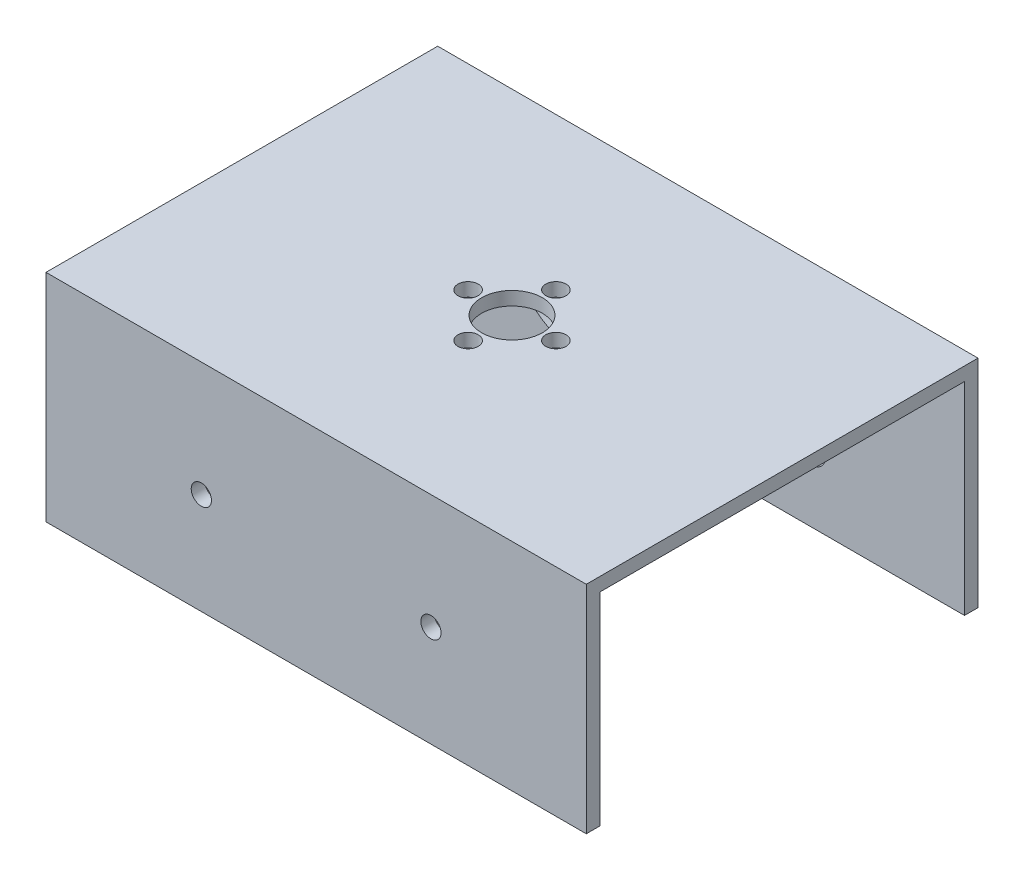
ISO-10303-21;
HEADER;
FILE_DESCRIPTION(('STEP AP214'),'2;1');
FILE_NAME('part.step','',(''),(''),'','','');
FILE_SCHEMA(('AUTOMOTIVE_DESIGN { 1 0 10303 214 1 1 1 1 }'));
ENDSEC;
DATA;
#1=APPLICATION_CONTEXT('core data for automotive mechanical design processes');
#2=APPLICATION_PROTOCOL_DEFINITION('international standard','automotive_design',2000,#1);
#3=PRODUCT_CONTEXT('',#1,'mechanical');
#4=PRODUCT('Part','Part','',(#3));
#5=PRODUCT_RELATED_PRODUCT_CATEGORY('part','',(#4));
#6=PRODUCT_DEFINITION_FORMATION('','',#4);
#7=PRODUCT_DEFINITION_CONTEXT('part definition',#1,'design');
#8=PRODUCT_DEFINITION('design','',#6,#7);
#9=PRODUCT_DEFINITION_SHAPE('','',#8);
#10=(LENGTH_UNIT() NAMED_UNIT(*) SI_UNIT(.MILLI.,.METRE.));
#11=(NAMED_UNIT(*) PLANE_ANGLE_UNIT() SI_UNIT($,.RADIAN.));
#12=(NAMED_UNIT(*) SI_UNIT($,.STERADIAN.) SOLID_ANGLE_UNIT());
#13=UNCERTAINTY_MEASURE_WITH_UNIT(LENGTH_MEASURE(1.E-05),#10,'distance_accuracy_value','');
#14=(GEOMETRIC_REPRESENTATION_CONTEXT(3) GLOBAL_UNCERTAINTY_ASSIGNED_CONTEXT((#13)) GLOBAL_UNIT_ASSIGNED_CONTEXT((#10,
#11,#12)) REPRESENTATION_CONTEXT('',''));
#15=CARTESIAN_POINT('',(0.,0.,0.));
#16=DIRECTION('',(0.,0.,1.));
#17=DIRECTION('',(1.,0.,0.));
#18=AXIS2_PLACEMENT_3D('',#15,#16,#17);
#19=CARTESIAN_POINT('',(0.,15.,0.));
#20=DIRECTION('',(0.,-1.,0.));
#21=DIRECTION('',(0.,0.,-1.));
#22=AXIS2_PLACEMENT_3D('',#19,#20,#21);
#23=PLANE('',#22);
#24=CARTESIAN_POINT('',(-6.49999999999999,15.,-27.));
#25=DIRECTION('',(0.,-1.,0.));
#26=DIRECTION('',(0.,0.,-1.));
#27=AXIS2_PLACEMENT_3D('',#24,#25,#26);
#28=CIRCLE('',#27,1.5);
#29=CARTESIAN_POINT('',(-6.49999999999999,15.,-28.5));
#30=VERTEX_POINT('',#29);
#31=EDGE_CURVE('E193',#30,#30,#28,.F.);
#32=ORIENTED_EDGE('',*,*,#31,.T.);
#33=EDGE_LOOP('',(#32));
#34=FACE_BOUND('',#33,.T.);
#35=CARTESIAN_POINT('',(6.5,15.,-27.));
#36=DIRECTION('',(0.,-1.,0.));
#37=DIRECTION('',(0.,0.,-1.));
#38=AXIS2_PLACEMENT_3D('',#35,#36,#37);
#39=CIRCLE('',#38,1.5);
#40=CARTESIAN_POINT('',(6.5,15.,-28.5));
#41=VERTEX_POINT('',#40);
#42=EDGE_CURVE('E199',#41,#41,#39,.F.);
#43=ORIENTED_EDGE('',*,*,#42,.T.);
#44=EDGE_LOOP('',(#43));
#45=FACE_BOUND('',#44,.T.);
#46=CARTESIAN_POINT('',(0.,15.,-33.5));
#47=DIRECTION('',(0.,-1.,0.));
#48=DIRECTION('',(0.,0.,-1.));
#49=AXIS2_PLACEMENT_3D('',#46,#47,#48);
#50=CIRCLE('',#49,1.5);
#51=CARTESIAN_POINT('',(0.,15.,-35.));
#52=VERTEX_POINT('',#51);
#53=EDGE_CURVE('E200',#52,#52,#50,.F.);
#54=ORIENTED_EDGE('',*,*,#53,.T.);
#55=EDGE_LOOP('',(#54));
#56=FACE_BOUND('',#55,.T.);
#57=CARTESIAN_POINT('',(0.,15.,-20.5));
#58=DIRECTION('',(0.,-1.,0.));
#59=DIRECTION('',(0.,0.,-1.));
#60=AXIS2_PLACEMENT_3D('',#57,#58,#59);
#61=CIRCLE('',#60,1.5);
#62=CARTESIAN_POINT('',(0.,15.,-22.));
#63=VERTEX_POINT('',#62);
#64=EDGE_CURVE('E211',#63,#63,#61,.F.);
#65=ORIENTED_EDGE('',*,*,#64,.T.);
#66=EDGE_LOOP('',(#65));
#67=FACE_BOUND('',#66,.T.);
#68=CARTESIAN_POINT('',(0.,15.,-27.));
#69=DIRECTION('',(0.,-1.,0.));
#70=DIRECTION('',(0.,0.,-1.));
#71=AXIS2_PLACEMENT_3D('',#68,#69,#70);
#72=CIRCLE('',#71,4.5);
#73=CARTESIAN_POINT('',(0.,15.,-31.5));
#74=VERTEX_POINT('',#73);
#75=EDGE_CURVE('E190',#74,#74,#72,.F.);
#76=ORIENTED_EDGE('',*,*,#75,.T.);
#77=EDGE_LOOP('',(#76));
#78=FACE_BOUND('',#77,.T.);
#79=DIRECTION('',(0.,0.,1.));
#80=VECTOR('',#79,1.);
#81=CARTESIAN_POINT('',(-40.,15.,2.));
#82=LINE('',#81,#80);
#83=CARTESIAN_POINT('',(-40.,15.,-54.));
#84=VERTEX_POINT('',#83);
#85=CARTESIAN_POINT('',(-40.,15.,0.));
#86=VERTEX_POINT('',#85);
#87=EDGE_CURVE('E115',#84,#86,#82,.T.);
#88=ORIENTED_EDGE('',*,*,#87,.F.);
#89=DIRECTION('',(-1.,0.,0.));
#90=VECTOR('',#89,1.);
#91=CARTESIAN_POINT('',(40.,15.,-54.));
#92=LINE('',#91,#90);
#93=CARTESIAN_POINT('',(40.,15.,-54.));
#94=VERTEX_POINT('',#93);
#95=EDGE_CURVE('E120',#94,#84,#92,.T.);
#96=ORIENTED_EDGE('',*,*,#95,.F.);
#97=DIRECTION('',(0.,0.,-1.));
#98=VECTOR('',#97,1.);
#99=CARTESIAN_POINT('',(40.,15.,-56.));
#100=LINE('',#99,#98);
#101=CARTESIAN_POINT('',(40.,15.,0.));
#102=VERTEX_POINT('',#101);
#103=EDGE_CURVE('E119',#102,#94,#100,.T.);
#104=ORIENTED_EDGE('',*,*,#103,.F.);
#105=DIRECTION('',(-1.,0.,0.));
#106=VECTOR('',#105,1.);
#107=CARTESIAN_POINT('',(-40.,15.,0.));
#108=LINE('',#107,#106);
#109=EDGE_CURVE('E99',#102,#86,#108,.T.);
#110=ORIENTED_EDGE('',*,*,#109,.T.);
#111=EDGE_LOOP('',(#88,#96,#104,#110));
#112=FACE_BOUND('',#111,.T.);
#113=ADVANCED_FACE('F39',(#34,#45,#56,#67,#78,#112),#23,.T.);
#114=CARTESIAN_POINT('',(40.,-15.,2.));
#115=DIRECTION('',(-1.,0.,0.));
#116=DIRECTION('',(0.,0.,1.));
#117=AXIS2_PLACEMENT_3D('',#114,#115,#116);
#118=PLANE('',#117);
#119=DIRECTION('',(0.,1.,0.));
#120=VECTOR('',#119,1.);
#121=CARTESIAN_POINT('',(40.,-15.,0.));
#122=LINE('',#121,#120);
#123=CARTESIAN_POINT('',(40.,-15.,0.));
#124=VERTEX_POINT('',#123);
#125=EDGE_CURVE('E93',#124,#102,#122,.T.);
#126=ORIENTED_EDGE('',*,*,#125,.T.);
#127=ORIENTED_EDGE('',*,*,#103,.T.);
#128=DIRECTION('',(0.,1.,0.));
#129=VECTOR('',#128,1.);
#130=CARTESIAN_POINT('',(40.,-15.,-54.));
#131=LINE('',#130,#129);
#132=CARTESIAN_POINT('',(40.,-15.,-54.));
#133=VERTEX_POINT('',#132);
#134=EDGE_CURVE('E55',#133,#94,#131,.T.);
#135=ORIENTED_EDGE('',*,*,#134,.F.);
#136=DIRECTION('',(0.,0.,1.));
#137=VECTOR('',#136,1.);
#138=CARTESIAN_POINT('',(40.,-15.,-56.));
#139=LINE('',#138,#137);
#140=CARTESIAN_POINT('',(40.,-15.,-56.));
#141=VERTEX_POINT('',#140);
#142=EDGE_CURVE('E156',#141,#133,#139,.T.);
#143=ORIENTED_EDGE('',*,*,#142,.F.);
#144=DIRECTION('',(0.,-1.,0.));
#145=VECTOR('',#144,1.);
#146=CARTESIAN_POINT('',(40.,17.,-56.));
#147=LINE('',#146,#145);
#148=CARTESIAN_POINT('',(40.,17.,-56.));
#149=VERTEX_POINT('',#148);
#150=EDGE_CURVE('E104',#149,#141,#147,.T.);
#151=ORIENTED_EDGE('',*,*,#150,.F.);
#152=DIRECTION('',(0.,0.,-1.));
#153=VECTOR('',#152,1.);
#154=CARTESIAN_POINT('',(40.,17.,-56.));
#155=LINE('',#154,#153);
#156=CARTESIAN_POINT('',(40.,17.,2.));
#157=VERTEX_POINT('',#156);
#158=EDGE_CURVE('E130',#157,#149,#155,.T.);
#159=ORIENTED_EDGE('',*,*,#158,.F.);
#160=DIRECTION('',(0.,1.,0.));
#161=VECTOR('',#160,1.);
#162=CARTESIAN_POINT('',(40.,-15.,2.));
#163=LINE('',#162,#161);
#164=CARTESIAN_POINT('',(40.,-15.,2.));
#165=VERTEX_POINT('',#164);
#166=EDGE_CURVE('E87',#165,#157,#163,.T.);
#167=ORIENTED_EDGE('',*,*,#166,.F.);
#168=DIRECTION('',(0.,0.,-1.));
#169=VECTOR('',#168,1.);
#170=CARTESIAN_POINT('',(40.,-15.,2.));
#171=LINE('',#170,#169);
#172=EDGE_CURVE('E48',#165,#124,#171,.T.);
#173=ORIENTED_EDGE('',*,*,#172,.T.);
#174=EDGE_LOOP('',(#126,#127,#135,#143,#151,#159,#167,#173));
#175=FACE_BOUND('',#174,.T.);
#176=ADVANCED_FACE('F41',(#175),#118,.F.);
#177=CARTESIAN_POINT('',(-40.,-15.,2.));
#178=DIRECTION('',(1.,0.,0.));
#179=DIRECTION('',(0.,0.,-1.));
#180=AXIS2_PLACEMENT_3D('',#177,#178,#179);
#181=PLANE('',#180);
#182=DIRECTION('',(0.,-1.,0.));
#183=VECTOR('',#182,1.);
#184=CARTESIAN_POINT('',(-40.,-15.,0.));
#185=LINE('',#184,#183);
#186=CARTESIAN_POINT('',(-40.,-15.,0.));
#187=VERTEX_POINT('',#186);
#188=EDGE_CURVE('E88',#86,#187,#185,.T.);
#189=ORIENTED_EDGE('',*,*,#188,.T.);
#190=DIRECTION('',(0.,0.,-1.));
#191=VECTOR('',#190,1.);
#192=CARTESIAN_POINT('',(-40.,-15.,2.));
#193=LINE('',#192,#191);
#194=CARTESIAN_POINT('',(-40.,-15.,2.));
#195=VERTEX_POINT('',#194);
#196=EDGE_CURVE('E11',#195,#187,#193,.T.);
#197=ORIENTED_EDGE('',*,*,#196,.F.);
#198=DIRECTION('',(0.,-1.,0.));
#199=VECTOR('',#198,1.);
#200=CARTESIAN_POINT('',(-40.,-15.,2.));
#201=LINE('',#200,#199);
#202=CARTESIAN_POINT('',(-40.,17.,2.));
#203=VERTEX_POINT('',#202);
#204=EDGE_CURVE('E132',#203,#195,#201,.T.);
#205=ORIENTED_EDGE('',*,*,#204,.F.);
#206=DIRECTION('',(0.,0.,1.));
#207=VECTOR('',#206,1.);
#208=CARTESIAN_POINT('',(-40.,17.,2.));
#209=LINE('',#208,#207);
#210=CARTESIAN_POINT('',(-40.,17.,-56.));
#211=VERTEX_POINT('',#210);
#212=EDGE_CURVE('E124',#211,#203,#209,.T.);
#213=ORIENTED_EDGE('',*,*,#212,.F.);
#214=DIRECTION('',(0.,-1.,0.));
#215=VECTOR('',#214,1.);
#216=CARTESIAN_POINT('',(-40.,17.,-56.));
#217=LINE('',#216,#215);
#218=CARTESIAN_POINT('',(-40.,-15.,-56.));
#219=VERTEX_POINT('',#218);
#220=EDGE_CURVE('E100',#211,#219,#217,.T.);
#221=ORIENTED_EDGE('',*,*,#220,.T.);
#222=DIRECTION('',(0.,0.,-1.));
#223=VECTOR('',#222,1.);
#224=CARTESIAN_POINT('',(-40.,-15.,-54.));
#225=LINE('',#224,#223);
#226=CARTESIAN_POINT('',(-40.,-15.,-54.));
#227=VERTEX_POINT('',#226);
#228=EDGE_CURVE('E167',#227,#219,#225,.T.);
#229=ORIENTED_EDGE('',*,*,#228,.F.);
#230=DIRECTION('',(0.,1.,0.));
#231=VECTOR('',#230,1.);
#232=CARTESIAN_POINT('',(-40.,-15.,-54.));
#233=LINE('',#232,#231);
#234=EDGE_CURVE('E180',#227,#84,#233,.T.);
#235=ORIENTED_EDGE('',*,*,#234,.T.);
#236=ORIENTED_EDGE('',*,*,#87,.T.);
#237=EDGE_LOOP('',(#189,#197,#205,#213,#221,#229,#235,#236));
#238=FACE_BOUND('',#237,.T.);
#239=ADVANCED_FACE('F111',(#238),#181,.F.);
#240=CARTESIAN_POINT('',(-40.,-15.,2.));
#241=DIRECTION('',(0.,1.,0.));
#242=DIRECTION('',(0.,0.,1.));
#243=AXIS2_PLACEMENT_3D('',#240,#241,#242);
#244=PLANE('',#243);
#245=DIRECTION('',(1.,0.,0.));
#246=VECTOR('',#245,1.);
#247=CARTESIAN_POINT('',(-40.,-15.,0.));
#248=LINE('',#247,#246);
#249=EDGE_CURVE('E79',#187,#124,#248,.T.);
#250=ORIENTED_EDGE('',*,*,#249,.T.);
#251=ORIENTED_EDGE('',*,*,#172,.F.);
#252=DIRECTION('',(1.,0.,0.));
#253=VECTOR('',#252,1.);
#254=CARTESIAN_POINT('',(-40.,-15.,2.));
#255=LINE('',#254,#253);
#256=EDGE_CURVE('E64',#195,#165,#255,.T.);
#257=ORIENTED_EDGE('',*,*,#256,.F.);
#258=ORIENTED_EDGE('',*,*,#196,.T.);
#259=EDGE_LOOP('',(#250,#251,#257,#258));
#260=FACE_BOUND('',#259,.T.);
#261=ADVANCED_FACE('F81',(#260),#244,.F.);
#262=CARTESIAN_POINT('',(0.,0.,2.));
#263=DIRECTION('',(0.,0.,-1.));
#264=DIRECTION('',(-1.,0.,0.));
#265=AXIS2_PLACEMENT_3D('',#262,#263,#264);
#266=PLANE('',#265);
#267=CARTESIAN_POINT('',(17.,0.,2.));
#268=DIRECTION('',(0.,0.,-1.));
#269=DIRECTION('',(-1.,0.,0.));
#270=AXIS2_PLACEMENT_3D('',#267,#268,#269);
#271=CIRCLE('',#270,1.5);
#272=CARTESIAN_POINT('',(15.5,0.,2.));
#273=VERTEX_POINT('',#272);
#274=EDGE_CURVE('E225',#273,#273,#271,.F.);
#275=ORIENTED_EDGE('',*,*,#274,.F.);
#276=EDGE_LOOP('',(#275));
#277=FACE_BOUND('',#276,.T.);
#278=CARTESIAN_POINT('',(-17.,0.,2.));
#279=DIRECTION('',(0.,0.,-1.));
#280=DIRECTION('',(-1.,0.,0.));
#281=AXIS2_PLACEMENT_3D('',#278,#279,#280);
#282=CIRCLE('',#281,1.5);
#283=CARTESIAN_POINT('',(-18.5,0.,2.));
#284=VERTEX_POINT('',#283);
#285=EDGE_CURVE('E226',#284,#284,#282,.F.);
#286=ORIENTED_EDGE('',*,*,#285,.F.);
#287=EDGE_LOOP('',(#286));
#288=FACE_BOUND('',#287,.T.);
#289=ORIENTED_EDGE('',*,*,#166,.T.);
#290=DIRECTION('',(1.,0.,0.));
#291=VECTOR('',#290,1.);
#292=CARTESIAN_POINT('',(-40.,17.,2.));
#293=LINE('',#292,#291);
#294=EDGE_CURVE('E137',#203,#157,#293,.T.);
#295=ORIENTED_EDGE('',*,*,#294,.F.);
#296=ORIENTED_EDGE('',*,*,#204,.T.);
#297=ORIENTED_EDGE('',*,*,#256,.T.);
#298=EDGE_LOOP('',(#289,#295,#296,#297));
#299=FACE_BOUND('',#298,.T.);
#300=ADVANCED_FACE('F134',(#277,#288,#299),#266,.F.);
#301=CARTESIAN_POINT('',(0.,0.,0.));
#302=DIRECTION('',(0.,0.,-1.));
#303=DIRECTION('',(-1.,0.,0.));
#304=AXIS2_PLACEMENT_3D('',#301,#302,#303);
#305=PLANE('',#304);
#306=CARTESIAN_POINT('',(17.,0.,0.));
#307=DIRECTION('',(0.,0.,-1.));
#308=DIRECTION('',(-1.,0.,0.));
#309=AXIS2_PLACEMENT_3D('',#306,#307,#308);
#310=CIRCLE('',#309,1.5);
#311=CARTESIAN_POINT('',(15.5,0.,0.));
#312=VERTEX_POINT('',#311);
#313=EDGE_CURVE('E212',#312,#312,#310,.T.);
#314=ORIENTED_EDGE('',*,*,#313,.F.);
#315=EDGE_LOOP('',(#314));
#316=FACE_BOUND('',#315,.T.);
#317=CARTESIAN_POINT('',(-17.,0.,0.));
#318=DIRECTION('',(0.,0.,-1.));
#319=DIRECTION('',(-1.,0.,0.));
#320=AXIS2_PLACEMENT_3D('',#317,#318,#319);
#321=CIRCLE('',#320,1.5);
#322=CARTESIAN_POINT('',(-18.5,0.,0.));
#323=VERTEX_POINT('',#322);
#324=EDGE_CURVE('E222',#323,#323,#321,.T.);
#325=ORIENTED_EDGE('',*,*,#324,.F.);
#326=EDGE_LOOP('',(#325));
#327=FACE_BOUND('',#326,.T.);
#328=ORIENTED_EDGE('',*,*,#125,.F.);
#329=ORIENTED_EDGE('',*,*,#249,.F.);
#330=ORIENTED_EDGE('',*,*,#188,.F.);
#331=ORIENTED_EDGE('',*,*,#109,.F.);
#332=EDGE_LOOP('',(#328,#329,#330,#331));
#333=FACE_BOUND('',#332,.T.);
#334=ADVANCED_FACE('F97',(#316,#327,#333),#305,.T.);
#335=CARTESIAN_POINT('',(-40.,17.,-56.));
#336=DIRECTION('',(0.,0.,1.));
#337=DIRECTION('',(1.,0.,0.));
#338=AXIS2_PLACEMENT_3D('',#335,#336,#337);
#339=PLANE('',#338);
#340=CARTESIAN_POINT('',(-32.07,5.,-56.));
#341=DIRECTION('',(0.,0.,1.));
#342=DIRECTION('',(1.,0.,0.));
#343=AXIS2_PLACEMENT_3D('',#340,#341,#342);
#344=CIRCLE('',#343,2.);
#345=CARTESIAN_POINT('',(-30.07,5.,-56.));
#346=VERTEX_POINT('',#345);
#347=EDGE_CURVE('E248',#346,#346,#344,.F.);
#348=ORIENTED_EDGE('',*,*,#347,.F.);
#349=EDGE_LOOP('',(#348));
#350=FACE_BOUND('',#349,.T.);
#351=CARTESIAN_POINT('',(-32.07,-5.,-56.));
#352=DIRECTION('',(0.,0.,1.));
#353=DIRECTION('',(1.,0.,0.));
#354=AXIS2_PLACEMENT_3D('',#351,#352,#353);
#355=CIRCLE('',#354,2.);
#356=CARTESIAN_POINT('',(-30.07,-5.,-56.));
#357=VERTEX_POINT('',#356);
#358=EDGE_CURVE('E257',#357,#357,#355,.F.);
#359=ORIENTED_EDGE('',*,*,#358,.F.);
#360=EDGE_LOOP('',(#359));
#361=FACE_BOUND('',#360,.T.);
#362=CARTESIAN_POINT('',(17.42,5.,-56.));
#363=DIRECTION('',(0.,0.,1.));
#364=DIRECTION('',(1.,0.,0.));
#365=AXIS2_PLACEMENT_3D('',#362,#363,#364);
#366=CIRCLE('',#365,2.);
#367=CARTESIAN_POINT('',(19.42,5.,-56.));
#368=VERTEX_POINT('',#367);
#369=EDGE_CURVE('E240',#368,#368,#366,.F.);
#370=ORIENTED_EDGE('',*,*,#369,.F.);
#371=EDGE_LOOP('',(#370));
#372=FACE_BOUND('',#371,.T.);
#373=CARTESIAN_POINT('',(17.42,-5.,-56.));
#374=DIRECTION('',(0.,0.,1.));
#375=DIRECTION('',(1.,0.,0.));
#376=AXIS2_PLACEMENT_3D('',#373,#374,#375);
#377=CIRCLE('',#376,2.);
#378=CARTESIAN_POINT('',(19.42,-5.,-56.));
#379=VERTEX_POINT('',#378);
#380=EDGE_CURVE('E245',#379,#379,#377,.F.);
#381=ORIENTED_EDGE('',*,*,#380,.F.);
#382=EDGE_LOOP('',(#381));
#383=FACE_BOUND('',#382,.T.);
#384=CARTESIAN_POINT('',(-17.,0.,-56.));
#385=DIRECTION('',(0.,0.,-1.));
#386=DIRECTION('',(-1.,0.,0.));
#387=AXIS2_PLACEMENT_3D('',#384,#385,#386);
#388=CIRCLE('',#387,10.);
#389=CARTESIAN_POINT('',(-27.,0.,-56.));
#390=VERTEX_POINT('',#389);
#391=EDGE_CURVE('E237',#390,#390,#388,.T.);
#392=ORIENTED_EDGE('',*,*,#391,.F.);
#393=EDGE_LOOP('',(#392));
#394=FACE_BOUND('',#393,.T.);
#395=CARTESIAN_POINT('',(17.,0.,-56.));
#396=DIRECTION('',(0.,0.,-1.));
#397=DIRECTION('',(-1.,0.,0.));
#398=AXIS2_PLACEMENT_3D('',#395,#396,#397);
#399=CIRCLE('',#398,1.5);
#400=CARTESIAN_POINT('',(15.5,0.,-56.));
#401=VERTEX_POINT('',#400);
#402=EDGE_CURVE('E229',#401,#401,#399,.T.);
#403=ORIENTED_EDGE('',*,*,#402,.F.);
#404=EDGE_LOOP('',(#403));
#405=FACE_BOUND('',#404,.T.);
#406=ORIENTED_EDGE('',*,*,#150,.T.);
#407=DIRECTION('',(1.,0.,0.));
#408=VECTOR('',#407,1.);
#409=CARTESIAN_POINT('',(-40.,-15.,-56.));
#410=LINE('',#409,#408);
#411=EDGE_CURVE('E162',#219,#141,#410,.T.);
#412=ORIENTED_EDGE('',*,*,#411,.F.);
#413=ORIENTED_EDGE('',*,*,#220,.F.);
#414=DIRECTION('',(-1.,0.,0.));
#415=VECTOR('',#414,1.);
#416=CARTESIAN_POINT('',(-40.,17.,-56.));
#417=LINE('',#416,#415);
#418=EDGE_CURVE('E121',#149,#211,#417,.T.);
#419=ORIENTED_EDGE('',*,*,#418,.F.);
#420=EDGE_LOOP('',(#406,#412,#413,#419));
#421=FACE_BOUND('',#420,.T.);
#422=ADVANCED_FACE('F160',(#350,#361,#372,#383,#394,#405,#421),#339,.F.);
#423=CARTESIAN_POINT('',(0.,17.,0.));
#424=DIRECTION('',(0.,-1.,0.));
#425=DIRECTION('',(0.,0.,-1.));
#426=AXIS2_PLACEMENT_3D('',#423,#424,#425);
#427=PLANE('',#426);
#428=CARTESIAN_POINT('',(-6.49999999999999,17.,-27.));
#429=DIRECTION('',(0.,1.,0.));
#430=DIRECTION('',(0.,0.,1.));
#431=AXIS2_PLACEMENT_3D('',#428,#429,#430);
#432=CIRCLE('',#431,1.5);
#433=CARTESIAN_POINT('',(-6.49999999999999,17.,-25.5));
#434=VERTEX_POINT('',#433);
#435=EDGE_CURVE('E203',#434,#434,#432,.T.);
#436=ORIENTED_EDGE('',*,*,#435,.F.);
#437=EDGE_LOOP('',(#436));
#438=FACE_BOUND('',#437,.T.);
#439=CARTESIAN_POINT('',(6.5,17.,-27.));
#440=DIRECTION('',(0.,1.,0.));
#441=DIRECTION('',(0.,0.,1.));
#442=AXIS2_PLACEMENT_3D('',#439,#440,#441);
#443=CIRCLE('',#442,1.5);
#444=CARTESIAN_POINT('',(6.5,17.,-25.5));
#445=VERTEX_POINT('',#444);
#446=EDGE_CURVE('E196',#445,#445,#443,.T.);
#447=ORIENTED_EDGE('',*,*,#446,.F.);
#448=EDGE_LOOP('',(#447));
#449=FACE_BOUND('',#448,.T.);
#450=CARTESIAN_POINT('',(0.,17.,-33.5));
#451=DIRECTION('',(0.,1.,0.));
#452=DIRECTION('',(0.,0.,1.));
#453=AXIS2_PLACEMENT_3D('',#450,#451,#452);
#454=CIRCLE('',#453,1.5);
#455=CARTESIAN_POINT('',(0.,17.,-32.));
#456=VERTEX_POINT('',#455);
#457=EDGE_CURVE('E215',#456,#456,#454,.T.);
#458=ORIENTED_EDGE('',*,*,#457,.F.);
#459=EDGE_LOOP('',(#458));
#460=FACE_BOUND('',#459,.T.);
#461=CARTESIAN_POINT('',(0.,17.,-20.5));
#462=DIRECTION('',(0.,1.,0.));
#463=DIRECTION('',(0.,0.,1.));
#464=AXIS2_PLACEMENT_3D('',#461,#462,#463);
#465=CIRCLE('',#464,1.5);
#466=CARTESIAN_POINT('',(0.,17.,-19.));
#467=VERTEX_POINT('',#466);
#468=EDGE_CURVE('E208',#467,#467,#465,.T.);
#469=ORIENTED_EDGE('',*,*,#468,.F.);
#470=EDGE_LOOP('',(#469));
#471=FACE_BOUND('',#470,.T.);
#472=CARTESIAN_POINT('',(0.,17.,-27.));
#473=DIRECTION('',(0.,1.,0.));
#474=DIRECTION('',(0.,0.,1.));
#475=AXIS2_PLACEMENT_3D('',#472,#473,#474);
#476=CIRCLE('',#475,4.5);
#477=CARTESIAN_POINT('',(0.,17.,-22.5));
#478=VERTEX_POINT('',#477);
#479=EDGE_CURVE('E185',#478,#478,#476,.T.);
#480=ORIENTED_EDGE('',*,*,#479,.F.);
#481=EDGE_LOOP('',(#480));
#482=FACE_BOUND('',#481,.T.);
#483=ORIENTED_EDGE('',*,*,#418,.T.);
#484=ORIENTED_EDGE('',*,*,#212,.T.);
#485=ORIENTED_EDGE('',*,*,#294,.T.);
#486=ORIENTED_EDGE('',*,*,#158,.T.);
#487=EDGE_LOOP('',(#483,#484,#485,#486));
#488=FACE_BOUND('',#487,.T.);
#489=ADVANCED_FACE('F144',(#438,#449,#460,#471,#482,#488),#427,.F.);
#490=CARTESIAN_POINT('',(40.,-15.,-54.));
#491=DIRECTION('',(0.,0.,-1.));
#492=DIRECTION('',(-1.,0.,0.));
#493=AXIS2_PLACEMENT_3D('',#490,#491,#492);
#494=PLANE('',#493);
#495=CARTESIAN_POINT('',(-32.07,5.,-54.));
#496=DIRECTION('',(0.,0.,1.));
#497=DIRECTION('',(1.,0.,0.));
#498=AXIS2_PLACEMENT_3D('',#495,#496,#497);
#499=CIRCLE('',#498,2.);
#500=CARTESIAN_POINT('',(-30.07,5.,-54.));
#501=VERTEX_POINT('',#500);
#502=EDGE_CURVE('E256',#501,#501,#499,.T.);
#503=ORIENTED_EDGE('',*,*,#502,.F.);
#504=EDGE_LOOP('',(#503));
#505=FACE_BOUND('',#504,.T.);
#506=CARTESIAN_POINT('',(-32.07,-5.,-54.));
#507=DIRECTION('',(0.,0.,1.));
#508=DIRECTION('',(1.,0.,0.));
#509=AXIS2_PLACEMENT_3D('',#506,#507,#508);
#510=CIRCLE('',#509,2.);
#511=CARTESIAN_POINT('',(-30.07,-5.,-54.));
#512=VERTEX_POINT('',#511);
#513=EDGE_CURVE('E253',#512,#512,#510,.T.);
#514=ORIENTED_EDGE('',*,*,#513,.F.);
#515=EDGE_LOOP('',(#514));
#516=FACE_BOUND('',#515,.T.);
#517=CARTESIAN_POINT('',(17.42,5.,-54.));
#518=DIRECTION('',(0.,0.,1.));
#519=DIRECTION('',(1.,0.,0.));
#520=AXIS2_PLACEMENT_3D('',#517,#518,#519);
#521=CIRCLE('',#520,2.);
#522=CARTESIAN_POINT('',(19.42,5.,-54.));
#523=VERTEX_POINT('',#522);
#524=EDGE_CURVE('E244',#523,#523,#521,.T.);
#525=ORIENTED_EDGE('',*,*,#524,.F.);
#526=EDGE_LOOP('',(#525));
#527=FACE_BOUND('',#526,.T.);
#528=CARTESIAN_POINT('',(17.42,-5.,-54.));
#529=DIRECTION('',(0.,0.,1.));
#530=DIRECTION('',(1.,0.,0.));
#531=AXIS2_PLACEMENT_3D('',#528,#529,#530);
#532=CIRCLE('',#531,2.);
#533=CARTESIAN_POINT('',(19.42,-5.,-54.));
#534=VERTEX_POINT('',#533);
#535=EDGE_CURVE('E241',#534,#534,#532,.T.);
#536=ORIENTED_EDGE('',*,*,#535,.F.);
#537=EDGE_LOOP('',(#536));
#538=FACE_BOUND('',#537,.T.);
#539=CARTESIAN_POINT('',(-17.,0.,-54.));
#540=DIRECTION('',(0.,0.,-1.));
#541=DIRECTION('',(-1.,0.,0.));
#542=AXIS2_PLACEMENT_3D('',#539,#540,#541);
#543=CIRCLE('',#542,10.);
#544=CARTESIAN_POINT('',(-27.,0.,-54.));
#545=VERTEX_POINT('',#544);
#546=EDGE_CURVE('E230',#545,#545,#543,.F.);
#547=ORIENTED_EDGE('',*,*,#546,.F.);
#548=EDGE_LOOP('',(#547));
#549=FACE_BOUND('',#548,.T.);
#550=CARTESIAN_POINT('',(17.,0.,-54.));
#551=DIRECTION('',(0.,0.,-1.));
#552=DIRECTION('',(-1.,0.,0.));
#553=AXIS2_PLACEMENT_3D('',#550,#551,#552);
#554=CIRCLE('',#553,1.5);
#555=CARTESIAN_POINT('',(15.5,0.,-54.));
#556=VERTEX_POINT('',#555);
#557=EDGE_CURVE('E43',#556,#556,#554,.T.);
#558=ORIENTED_EDGE('',*,*,#557,.T.);
#559=EDGE_LOOP('',(#558));
#560=FACE_BOUND('',#559,.T.);
#561=ORIENTED_EDGE('',*,*,#95,.T.);
#562=ORIENTED_EDGE('',*,*,#234,.F.);
#563=DIRECTION('',(-1.,0.,0.));
#564=VECTOR('',#563,1.);
#565=CARTESIAN_POINT('',(40.,-15.,-54.));
#566=LINE('',#565,#564);
#567=EDGE_CURVE('E177',#133,#227,#566,.T.);
#568=ORIENTED_EDGE('',*,*,#567,.F.);
#569=ORIENTED_EDGE('',*,*,#134,.T.);
#570=EDGE_LOOP('',(#561,#562,#568,#569));
#571=FACE_BOUND('',#570,.T.);
#572=ADVANCED_FACE('F182',(#505,#516,#527,#538,#549,#560,#571),#494,.F.);
#573=CARTESIAN_POINT('',(0.,-15.,0.));
#574=DIRECTION('',(0.,-1.,0.));
#575=DIRECTION('',(0.,0.,-1.));
#576=AXIS2_PLACEMENT_3D('',#573,#574,#575);
#577=PLANE('',#576);
#578=ORIENTED_EDGE('',*,*,#228,.T.);
#579=ORIENTED_EDGE('',*,*,#411,.T.);
#580=ORIENTED_EDGE('',*,*,#142,.T.);
#581=ORIENTED_EDGE('',*,*,#567,.T.);
#582=EDGE_LOOP('',(#578,#579,#580,#581));
#583=FACE_BOUND('',#582,.T.);
#584=ADVANCED_FACE('F179',(#583),#577,.T.);
#585=CARTESIAN_POINT('',(0.,-15.001,-27.));
#586=DIRECTION('',(0.,1.,0.));
#587=DIRECTION('',(0.,0.,1.));
#588=AXIS2_PLACEMENT_3D('',#585,#586,#587);
#589=CYLINDRICAL_SURFACE('',#588,4.5);
#590=ORIENTED_EDGE('',*,*,#75,.F.);
#591=EDGE_LOOP('',(#590));
#592=FACE_BOUND('',#591,.T.);
#593=ORIENTED_EDGE('',*,*,#479,.T.);
#594=EDGE_LOOP('',(#593));
#595=FACE_BOUND('',#594,.T.);
#596=ADVANCED_FACE('F362',(#592,#595),#589,.F.);
#597=CARTESIAN_POINT('',(0.,-15.001,-20.5));
#598=DIRECTION('',(0.,1.,0.));
#599=DIRECTION('',(0.,0.,1.));
#600=AXIS2_PLACEMENT_3D('',#597,#598,#599);
#601=CYLINDRICAL_SURFACE('',#600,1.5);
#602=ORIENTED_EDGE('',*,*,#64,.F.);
#603=EDGE_LOOP('',(#602));
#604=FACE_BOUND('',#603,.T.);
#605=ORIENTED_EDGE('',*,*,#468,.T.);
#606=EDGE_LOOP('',(#605));
#607=FACE_BOUND('',#606,.T.);
#608=ADVANCED_FACE('F368',(#604,#607),#601,.F.);
#609=CARTESIAN_POINT('',(0.,-15.001,-33.5));
#610=DIRECTION('',(0.,1.,0.));
#611=DIRECTION('',(0.,0.,1.));
#612=AXIS2_PLACEMENT_3D('',#609,#610,#611);
#613=CYLINDRICAL_SURFACE('',#612,1.5);
#614=ORIENTED_EDGE('',*,*,#53,.F.);
#615=EDGE_LOOP('',(#614));
#616=FACE_BOUND('',#615,.T.);
#617=ORIENTED_EDGE('',*,*,#457,.T.);
#618=EDGE_LOOP('',(#617));
#619=FACE_BOUND('',#618,.T.);
#620=ADVANCED_FACE('F376',(#616,#619),#613,.F.);
#621=CARTESIAN_POINT('',(6.5,-15.001,-27.));
#622=DIRECTION('',(0.,1.,0.));
#623=DIRECTION('',(0.,0.,1.));
#624=AXIS2_PLACEMENT_3D('',#621,#622,#623);
#625=CYLINDRICAL_SURFACE('',#624,1.5);
#626=ORIENTED_EDGE('',*,*,#42,.F.);
#627=EDGE_LOOP('',(#626));
#628=FACE_BOUND('',#627,.T.);
#629=ORIENTED_EDGE('',*,*,#446,.T.);
#630=EDGE_LOOP('',(#629));
#631=FACE_BOUND('',#630,.T.);
#632=ADVANCED_FACE('F295',(#628,#631),#625,.F.);
#633=CARTESIAN_POINT('',(-6.49999999999999,-15.001,-27.));
#634=DIRECTION('',(0.,1.,0.));
#635=DIRECTION('',(0.,0.,1.));
#636=AXIS2_PLACEMENT_3D('',#633,#634,#635);
#637=CYLINDRICAL_SURFACE('',#636,1.5);
#638=ORIENTED_EDGE('',*,*,#31,.F.);
#639=EDGE_LOOP('',(#638));
#640=FACE_BOUND('',#639,.T.);
#641=ORIENTED_EDGE('',*,*,#435,.T.);
#642=EDGE_LOOP('',(#641));
#643=FACE_BOUND('',#642,.T.);
#644=ADVANCED_FACE('F285',(#640,#643),#637,.F.);
#645=CARTESIAN_POINT('',(17.,0.,6.24264068711929));
#646=DIRECTION('',(0.,0.,-1.));
#647=DIRECTION('',(-1.,0.,0.));
#648=AXIS2_PLACEMENT_3D('',#645,#646,#647);
#649=CYLINDRICAL_SURFACE('',#648,1.5);
#650=ORIENTED_EDGE('',*,*,#402,.T.);
#651=EDGE_LOOP('',(#650));
#652=FACE_BOUND('',#651,.T.);
#653=ORIENTED_EDGE('',*,*,#557,.F.);
#654=EDGE_LOOP('',(#653));
#655=FACE_BOUND('',#654,.T.);
#656=ADVANCED_FACE('F282',(#652,#655),#649,.F.);
#657=CARTESIAN_POINT('',(-17.,0.,6.24264068711929));
#658=DIRECTION('',(0.,0.,-1.));
#659=DIRECTION('',(-1.,0.,0.));
#660=AXIS2_PLACEMENT_3D('',#657,#658,#659);
#661=CYLINDRICAL_SURFACE('',#660,1.5);
#662=ORIENTED_EDGE('',*,*,#324,.T.);
#663=EDGE_LOOP('',(#662));
#664=FACE_BOUND('',#663,.T.);
#665=ORIENTED_EDGE('',*,*,#285,.T.);
#666=EDGE_LOOP('',(#665));
#667=FACE_BOUND('',#666,.T.);
#668=ADVANCED_FACE('F284',(#664,#667),#661,.F.);
#669=ORIENTED_EDGE('',*,*,#313,.T.);
#670=EDGE_LOOP('',(#669));
#671=FACE_BOUND('',#670,.T.);
#672=ORIENTED_EDGE('',*,*,#274,.T.);
#673=EDGE_LOOP('',(#672));
#674=FACE_BOUND('',#673,.T.);
#675=ADVANCED_FACE('F288',(#671,#674),#649,.F.);
#676=CARTESIAN_POINT('',(-17.,0.,2.001));
#677=DIRECTION('',(0.,0.,-1.));
#678=DIRECTION('',(-1.,0.,0.));
#679=AXIS2_PLACEMENT_3D('',#676,#677,#678);
#680=CYLINDRICAL_SURFACE('',#679,10.);
#681=ORIENTED_EDGE('',*,*,#391,.T.);
#682=EDGE_LOOP('',(#681));
#683=FACE_BOUND('',#682,.T.);
#684=ORIENTED_EDGE('',*,*,#546,.T.);
#685=EDGE_LOOP('',(#684));
#686=FACE_BOUND('',#685,.T.);
#687=ADVANCED_FACE('F300',(#683,#686),#680,.F.);
#688=CARTESIAN_POINT('',(17.42,-5.,-56.001));
#689=DIRECTION('',(0.,0.,1.));
#690=DIRECTION('',(1.,0.,0.));
#691=AXIS2_PLACEMENT_3D('',#688,#689,#690);
#692=CYLINDRICAL_SURFACE('',#691,2.);
#693=ORIENTED_EDGE('',*,*,#535,.T.);
#694=EDGE_LOOP('',(#693));
#695=FACE_BOUND('',#694,.T.);
#696=ORIENTED_EDGE('',*,*,#380,.T.);
#697=EDGE_LOOP('',(#696));
#698=FACE_BOUND('',#697,.T.);
#699=ADVANCED_FACE('F431',(#695,#698),#692,.F.);
#700=CARTESIAN_POINT('',(17.42,5.,-56.001));
#701=DIRECTION('',(0.,0.,1.));
#702=DIRECTION('',(1.,0.,0.));
#703=AXIS2_PLACEMENT_3D('',#700,#701,#702);
#704=CYLINDRICAL_SURFACE('',#703,2.);
#705=ORIENTED_EDGE('',*,*,#524,.T.);
#706=EDGE_LOOP('',(#705));
#707=FACE_BOUND('',#706,.T.);
#708=ORIENTED_EDGE('',*,*,#369,.T.);
#709=EDGE_LOOP('',(#708));
#710=FACE_BOUND('',#709,.T.);
#711=ADVANCED_FACE('F441',(#707,#710),#704,.F.);
#712=CARTESIAN_POINT('',(-32.07,-5.,-56.001));
#713=DIRECTION('',(0.,0.,1.));
#714=DIRECTION('',(1.,0.,0.));
#715=AXIS2_PLACEMENT_3D('',#712,#713,#714);
#716=CYLINDRICAL_SURFACE('',#715,2.);
#717=ORIENTED_EDGE('',*,*,#513,.T.);
#718=EDGE_LOOP('',(#717));
#719=FACE_BOUND('',#718,.T.);
#720=ORIENTED_EDGE('',*,*,#358,.T.);
#721=EDGE_LOOP('',(#720));
#722=FACE_BOUND('',#721,.T.);
#723=ADVANCED_FACE('F451',(#719,#722),#716,.F.);
#724=CARTESIAN_POINT('',(-32.07,5.,-56.001));
#725=DIRECTION('',(0.,0.,1.));
#726=DIRECTION('',(1.,0.,0.));
#727=AXIS2_PLACEMENT_3D('',#724,#725,#726);
#728=CYLINDRICAL_SURFACE('',#727,2.);
#729=ORIENTED_EDGE('',*,*,#502,.T.);
#730=EDGE_LOOP('',(#729));
#731=FACE_BOUND('',#730,.T.);
#732=ORIENTED_EDGE('',*,*,#347,.T.);
#733=EDGE_LOOP('',(#732));
#734=FACE_BOUND('',#733,.T.);
#735=ADVANCED_FACE('F265',(#731,#734),#728,.F.);
#736=CLOSED_SHELL('',(#113,#176,#239,#261,#300,#334,#422,#489,#572,#584,#596,#608,#620,#632,
#644,#656,#668,#675,#687,#699,#711,#723,#735));
#737=MANIFOLD_SOLID_BREP('B2',#736);
#738=ADVANCED_BREP_SHAPE_REPRESENTATION('',(#18,#737),#14);
#739=SHAPE_DEFINITION_REPRESENTATION(#9,#738);
ENDSEC;
END-ISO-10303-21;
